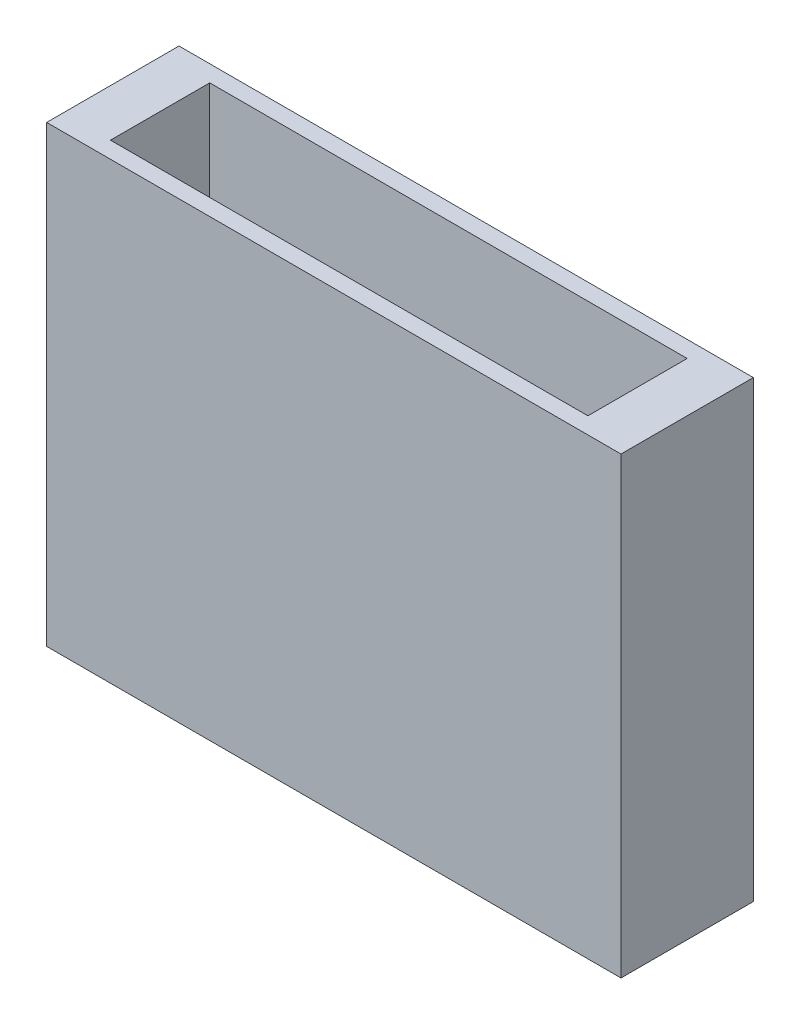
ISO-10303-21;
HEADER;
FILE_DESCRIPTION(('STEP AP214'),'2;1');
FILE_NAME('part.step','',(''),(''),'','','');
FILE_SCHEMA(('AUTOMOTIVE_DESIGN { 1 0 10303 214 1 1 1 1 }'));
ENDSEC;
DATA;
#1=APPLICATION_CONTEXT('core data for automotive mechanical design processes');
#2=APPLICATION_PROTOCOL_DEFINITION('international standard','automotive_design',2000,#1);
#3=PRODUCT_CONTEXT('',#1,'mechanical');
#4=PRODUCT('Part','Part','',(#3));
#5=PRODUCT_RELATED_PRODUCT_CATEGORY('part','',(#4));
#6=PRODUCT_DEFINITION_FORMATION('','',#4);
#7=PRODUCT_DEFINITION_CONTEXT('part definition',#1,'design');
#8=PRODUCT_DEFINITION('design','',#6,#7);
#9=PRODUCT_DEFINITION_SHAPE('','',#8);
#10=(LENGTH_UNIT() NAMED_UNIT(*) SI_UNIT(.MILLI.,.METRE.));
#11=(NAMED_UNIT(*) PLANE_ANGLE_UNIT() SI_UNIT($,.RADIAN.));
#12=(NAMED_UNIT(*) SI_UNIT($,.STERADIAN.) SOLID_ANGLE_UNIT());
#13=UNCERTAINTY_MEASURE_WITH_UNIT(LENGTH_MEASURE(1.E-05),#10,'distance_accuracy_value','');
#14=(GEOMETRIC_REPRESENTATION_CONTEXT(3) GLOBAL_UNCERTAINTY_ASSIGNED_CONTEXT((#13)) GLOBAL_UNIT_ASSIGNED_CONTEXT((#10,
#11,#12)) REPRESENTATION_CONTEXT('',''));
#15=CARTESIAN_POINT('',(0.,0.,0.));
#16=DIRECTION('',(0.,0.,1.));
#17=DIRECTION('',(1.,0.,0.));
#18=AXIS2_PLACEMENT_3D('',#15,#16,#17);
#19=CARTESIAN_POINT('',(0.,0.,5.6));
#20=DIRECTION('',(1.,0.,0.));
#21=DIRECTION('',(0.,0.,-1.));
#22=AXIS2_PLACEMENT_3D('',#19,#20,#21);
#23=PLANE('',#22);
#24=DIRECTION('',(0.,-1.,0.));
#25=VECTOR('',#24,1.);
#26=CARTESIAN_POINT('',(0.,0.,0.));
#27=LINE('',#26,#25);
#28=CARTESIAN_POINT('',(0.,19.2,0.));
#29=VERTEX_POINT('',#28);
#30=CARTESIAN_POINT('',(0.,0.,0.));
#31=VERTEX_POINT('',#30);
#32=EDGE_CURVE('E265',#29,#31,#27,.T.);
#33=ORIENTED_EDGE('',*,*,#32,.T.);
#34=DIRECTION('',(0.,0.,-1.));
#35=VECTOR('',#34,1.);
#36=CARTESIAN_POINT('',(0.,0.,5.6));
#37=LINE('',#36,#35);
#38=CARTESIAN_POINT('',(0.,0.,5.6));
#39=VERTEX_POINT('',#38);
#40=EDGE_CURVE('E312',#39,#31,#37,.T.);
#41=ORIENTED_EDGE('',*,*,#40,.F.);
#42=DIRECTION('',(0.,-1.,0.));
#43=VECTOR('',#42,1.);
#44=CARTESIAN_POINT('',(0.,0.,5.6));
#45=LINE('',#44,#43);
#46=CARTESIAN_POINT('',(0.,19.2,5.6));
#47=VERTEX_POINT('',#46);
#48=EDGE_CURVE('E275',#47,#39,#45,.T.);
#49=ORIENTED_EDGE('',*,*,#48,.F.);
#50=DIRECTION('',(0.,0.,-1.));
#51=VECTOR('',#50,1.);
#52=CARTESIAN_POINT('',(0.,19.2,5.6));
#53=LINE('',#52,#51);
#54=EDGE_CURVE('E289',#47,#29,#53,.T.);
#55=ORIENTED_EDGE('',*,*,#54,.T.);
#56=EDGE_LOOP('',(#33,#41,#49,#55));
#57=FACE_BOUND('',#56,.T.);
#58=ADVANCED_FACE('F39',(#57),#23,.F.);
#59=CARTESIAN_POINT('',(0.,0.,5.6));
#60=DIRECTION('',(0.,1.,0.));
#61=DIRECTION('',(0.,0.,1.));
#62=AXIS2_PLACEMENT_3D('',#59,#60,#61);
#63=PLANE('',#62);
#64=DIRECTION('',(1.,0.,0.));
#65=VECTOR('',#64,1.);
#66=CARTESIAN_POINT('',(0.,0.,0.));
#67=LINE('',#66,#65);
#68=CARTESIAN_POINT('',(24.3,0.,0.));
#69=VERTEX_POINT('',#68);
#70=EDGE_CURVE('E293',#31,#69,#67,.T.);
#71=ORIENTED_EDGE('',*,*,#70,.T.);
#72=DIRECTION('',(0.,0.,-1.));
#73=VECTOR('',#72,1.);
#74=CARTESIAN_POINT('',(24.3,0.,5.6));
#75=LINE('',#74,#73);
#76=CARTESIAN_POINT('',(24.3,0.,5.6));
#77=VERTEX_POINT('',#76);
#78=EDGE_CURVE('E308',#77,#69,#75,.T.);
#79=ORIENTED_EDGE('',*,*,#78,.F.);
#80=DIRECTION('',(1.,0.,0.));
#81=VECTOR('',#80,1.);
#82=CARTESIAN_POINT('',(0.,0.,5.6));
#83=LINE('',#82,#81);
#84=EDGE_CURVE('E279',#39,#77,#83,.T.);
#85=ORIENTED_EDGE('',*,*,#84,.F.);
#86=ORIENTED_EDGE('',*,*,#40,.T.);
#87=EDGE_LOOP('',(#71,#79,#85,#86));
#88=FACE_BOUND('',#87,.T.);
#89=ADVANCED_FACE('F440',(#88),#63,.F.);
#90=CARTESIAN_POINT('',(24.3,0.,5.6));
#91=DIRECTION('',(-1.,0.,0.));
#92=DIRECTION('',(0.,0.,1.));
#93=AXIS2_PLACEMENT_3D('',#90,#91,#92);
#94=PLANE('',#93);
#95=DIRECTION('',(0.,1.,0.));
#96=VECTOR('',#95,1.);
#97=CARTESIAN_POINT('',(24.3,0.,0.));
#98=LINE('',#97,#96);
#99=CARTESIAN_POINT('',(24.3,19.2,0.));
#100=VERTEX_POINT('',#99);
#101=EDGE_CURVE('E296',#69,#100,#98,.T.);
#102=ORIENTED_EDGE('',*,*,#101,.T.);
#103=DIRECTION('',(0.,0.,-1.));
#104=VECTOR('',#103,1.);
#105=CARTESIAN_POINT('',(24.3,19.2,5.6));
#106=LINE('',#105,#104);
#107=CARTESIAN_POINT('',(24.3,19.2,5.6));
#108=VERTEX_POINT('',#107);
#109=EDGE_CURVE('E304',#108,#100,#106,.T.);
#110=ORIENTED_EDGE('',*,*,#109,.F.);
#111=DIRECTION('',(0.,1.,0.));
#112=VECTOR('',#111,1.);
#113=CARTESIAN_POINT('',(24.3,0.,5.6));
#114=LINE('',#113,#112);
#115=EDGE_CURVE('E283',#77,#108,#114,.T.);
#116=ORIENTED_EDGE('',*,*,#115,.F.);
#117=ORIENTED_EDGE('',*,*,#78,.T.);
#118=EDGE_LOOP('',(#102,#110,#116,#117));
#119=FACE_BOUND('',#118,.T.);
#120=ADVANCED_FACE('F446',(#119),#94,.F.);
#121=CARTESIAN_POINT('',(0.,19.2,5.6));
#122=DIRECTION('',(0.,-1.,0.));
#123=DIRECTION('',(0.,0.,-1.));
#124=AXIS2_PLACEMENT_3D('',#121,#122,#123);
#125=PLANE('',#124);
#126=DIRECTION('',(1.,0.,0.));
#127=VECTOR('',#126,1.);
#128=CARTESIAN_POINT('',(2.,19.2,4.9));
#129=LINE('',#128,#127);
#130=CARTESIAN_POINT('',(2.,19.2,4.9));
#131=VERTEX_POINT('',#130);
#132=CARTESIAN_POINT('',(22.2,19.2,4.9));
#133=VERTEX_POINT('',#132);
#134=EDGE_CURVE('E251',#131,#133,#129,.T.);
#135=ORIENTED_EDGE('',*,*,#134,.F.);
#136=DIRECTION('',(0.,0.,1.));
#137=VECTOR('',#136,1.);
#138=CARTESIAN_POINT('',(2.,19.2,4.9));
#139=LINE('',#138,#137);
#140=CARTESIAN_POINT('',(2.,19.2,0.699999999999999));
#141=VERTEX_POINT('',#140);
#142=EDGE_CURVE('E219',#141,#131,#139,.T.);
#143=ORIENTED_EDGE('',*,*,#142,.F.);
#144=DIRECTION('',(-1.,0.,0.));
#145=VECTOR('',#144,1.);
#146=CARTESIAN_POINT('',(2.,19.2,0.699999999999999));
#147=LINE('',#146,#145);
#148=CARTESIAN_POINT('',(22.2,19.2,0.699999999999999));
#149=VERTEX_POINT('',#148);
#150=EDGE_CURVE('E236',#149,#141,#147,.T.);
#151=ORIENTED_EDGE('',*,*,#150,.F.);
#152=DIRECTION('',(0.,0.,-1.));
#153=VECTOR('',#152,1.);
#154=CARTESIAN_POINT('',(22.2,19.2,4.9));
#155=LINE('',#154,#153);
#156=EDGE_CURVE('E255',#133,#149,#155,.T.);
#157=ORIENTED_EDGE('',*,*,#156,.F.);
#158=EDGE_LOOP('',(#135,#143,#151,#157));
#159=FACE_BOUND('',#158,.T.);
#160=DIRECTION('',(-1.,0.,0.));
#161=VECTOR('',#160,1.);
#162=CARTESIAN_POINT('',(0.,19.2,0.));
#163=LINE('',#162,#161);
#164=EDGE_CURVE('E280',#100,#29,#163,.T.);
#165=ORIENTED_EDGE('',*,*,#164,.T.);
#166=ORIENTED_EDGE('',*,*,#54,.F.);
#167=DIRECTION('',(-1.,0.,0.));
#168=VECTOR('',#167,1.);
#169=CARTESIAN_POINT('',(0.,19.2,5.6));
#170=LINE('',#169,#168);
#171=EDGE_CURVE('E286',#108,#47,#170,.T.);
#172=ORIENTED_EDGE('',*,*,#171,.F.);
#173=ORIENTED_EDGE('',*,*,#109,.T.);
#174=EDGE_LOOP('',(#165,#166,#172,#173));
#175=FACE_BOUND('',#174,.T.);
#176=ADVANCED_FACE('F622',(#159,#175),#125,.F.);
#177=CARTESIAN_POINT('',(0.,0.,5.6));
#178=DIRECTION('',(0.,0.,-1.));
#179=DIRECTION('',(-1.,0.,0.));
#180=AXIS2_PLACEMENT_3D('',#177,#178,#179);
#181=PLANE('',#180);
#182=ORIENTED_EDGE('',*,*,#48,.T.);
#183=ORIENTED_EDGE('',*,*,#84,.T.);
#184=ORIENTED_EDGE('',*,*,#115,.T.);
#185=ORIENTED_EDGE('',*,*,#171,.T.);
#186=EDGE_LOOP('',(#182,#183,#184,#185));
#187=FACE_BOUND('',#186,.T.);
#188=ADVANCED_FACE('F568',(#187),#181,.F.);
#189=CARTESIAN_POINT('',(0.,0.,0.));
#190=DIRECTION('',(0.,0.,-1.));
#191=DIRECTION('',(-1.,0.,0.));
#192=AXIS2_PLACEMENT_3D('',#189,#190,#191);
#193=PLANE('',#192);
#194=DIRECTION('',(0.,-1.,0.));
#195=VECTOR('',#194,1.);
#196=CARTESIAN_POINT('',(21.0424776614557,16.8401074790745,0.));
#197=LINE('',#196,#195);
#198=CARTESIAN_POINT('',(21.0424776614557,16.8401074790745,0.));
#199=VERTEX_POINT('',#198);
#200=CARTESIAN_POINT('',(21.0424776614557,2.84010747907446,0.));
#201=VERTEX_POINT('',#200);
#202=EDGE_CURVE('E199',#199,#201,#197,.T.);
#203=ORIENTED_EDGE('',*,*,#202,.F.);
#204=DIRECTION('',(1.,0.,0.));
#205=VECTOR('',#204,1.);
#206=CARTESIAN_POINT('',(21.0424776614557,16.8401074790745,0.));
#207=LINE('',#206,#205);
#208=CARTESIAN_POINT('',(3.04247766145567,16.8401074790745,0.));
#209=VERTEX_POINT('',#208);
#210=EDGE_CURVE('E194',#209,#199,#207,.T.);
#211=ORIENTED_EDGE('',*,*,#210,.F.);
#212=DIRECTION('',(0.,1.,0.));
#213=VECTOR('',#212,1.);
#214=CARTESIAN_POINT('',(3.04247766145567,16.8401074790745,0.));
#215=LINE('',#214,#213);
#216=CARTESIAN_POINT('',(3.04247766145567,2.84010747907446,0.));
#217=VERTEX_POINT('',#216);
#218=EDGE_CURVE('E179',#217,#209,#215,.T.);
#219=ORIENTED_EDGE('',*,*,#218,.F.);
#220=DIRECTION('',(-1.,0.,0.));
#221=VECTOR('',#220,1.);
#222=CARTESIAN_POINT('',(21.0424776614557,2.84010747907446,0.));
#223=LINE('',#222,#221);
#224=EDGE_CURVE('E191',#201,#217,#223,.T.);
#225=ORIENTED_EDGE('',*,*,#224,.F.);
#226=EDGE_LOOP('',(#203,#211,#219,#225));
#227=FACE_BOUND('',#226,.T.);
#228=ORIENTED_EDGE('',*,*,#32,.F.);
#229=ORIENTED_EDGE('',*,*,#164,.F.);
#230=ORIENTED_EDGE('',*,*,#101,.F.);
#231=ORIENTED_EDGE('',*,*,#70,.F.);
#232=EDGE_LOOP('',(#228,#229,#230,#231));
#233=FACE_BOUND('',#232,.T.);
#234=ADVANCED_FACE('F189',(#227,#233),#193,.T.);
#235=CARTESIAN_POINT('',(2.,1.2,4.9));
#236=DIRECTION('',(-1.,0.,0.));
#237=DIRECTION('',(0.,0.,1.));
#238=AXIS2_PLACEMENT_3D('',#235,#236,#237);
#239=PLANE('',#238);
#240=ORIENTED_EDGE('',*,*,#142,.T.);
#241=DIRECTION('',(0.,1.,0.));
#242=VECTOR('',#241,1.);
#243=CARTESIAN_POINT('',(2.,1.2,4.9));
#244=LINE('',#243,#242);
#245=CARTESIAN_POINT('',(2.,1.2,4.9));
#246=VERTEX_POINT('',#245);
#247=EDGE_CURVE('E248',#246,#131,#244,.T.);
#248=ORIENTED_EDGE('',*,*,#247,.F.);
#249=DIRECTION('',(0.,0.,1.));
#250=VECTOR('',#249,1.);
#251=CARTESIAN_POINT('',(2.,1.2,4.9));
#252=LINE('',#251,#250);
#253=CARTESIAN_POINT('',(2.,1.2,0.699999999999999));
#254=VERTEX_POINT('',#253);
#255=EDGE_CURVE('E231',#254,#246,#252,.T.);
#256=ORIENTED_EDGE('',*,*,#255,.F.);
#257=DIRECTION('',(0.,1.,0.));
#258=VECTOR('',#257,1.);
#259=CARTESIAN_POINT('',(2.,1.2,0.699999999999999));
#260=LINE('',#259,#258);
#261=EDGE_CURVE('E262',#254,#141,#260,.T.);
#262=ORIENTED_EDGE('',*,*,#261,.T.);
#263=EDGE_LOOP('',(#240,#248,#256,#262));
#264=FACE_BOUND('',#263,.T.);
#265=ADVANCED_FACE('F567',(#264),#239,.F.);
#266=CARTESIAN_POINT('',(2.,1.2,0.699999999999999));
#267=DIRECTION('',(0.,0.,-1.));
#268=DIRECTION('',(-1.,0.,0.));
#269=AXIS2_PLACEMENT_3D('',#266,#267,#268);
#270=PLANE('',#269);
#271=DIRECTION('',(1.,0.,0.));
#272=VECTOR('',#271,1.);
#273=CARTESIAN_POINT('',(2.,13.,0.699999999999999));
#274=LINE('',#273,#272);
#275=CARTESIAN_POINT('',(9.65,13.,0.699999999999999));
#276=VERTEX_POINT('',#275);
#277=CARTESIAN_POINT('',(14.65,13.,0.699999999999999));
#278=VERTEX_POINT('',#277);
#279=EDGE_CURVE('E324',#276,#278,#274,.T.);
#280=ORIENTED_EDGE('',*,*,#279,.T.);
#281=DIRECTION('',(0.,-1.,0.));
#282=VECTOR('',#281,1.);
#283=CARTESIAN_POINT('',(14.65,1.2,0.699999999999999));
#284=LINE('',#283,#282);
#285=CARTESIAN_POINT('',(14.65,6.8,0.699999999999999));
#286=VERTEX_POINT('',#285);
#287=EDGE_CURVE('E328',#278,#286,#284,.T.);
#288=ORIENTED_EDGE('',*,*,#287,.T.);
#289=DIRECTION('',(-1.,0.,0.));
#290=VECTOR('',#289,1.);
#291=CARTESIAN_POINT('',(2.,6.8,0.699999999999999));
#292=LINE('',#291,#290);
#293=CARTESIAN_POINT('',(9.65,6.8,0.699999999999999));
#294=VERTEX_POINT('',#293);
#295=EDGE_CURVE('E316',#286,#294,#292,.T.);
#296=ORIENTED_EDGE('',*,*,#295,.T.);
#297=DIRECTION('',(0.,1.,0.));
#298=VECTOR('',#297,1.);
#299=CARTESIAN_POINT('',(9.65,1.2,0.699999999999999));
#300=LINE('',#299,#298);
#301=EDGE_CURVE('E320',#294,#276,#300,.T.);
#302=ORIENTED_EDGE('',*,*,#301,.T.);
#303=EDGE_LOOP('',(#280,#288,#296,#302));
#304=FACE_BOUND('',#303,.T.);
#305=ORIENTED_EDGE('',*,*,#150,.T.);
#306=ORIENTED_EDGE('',*,*,#261,.F.);
#307=DIRECTION('',(-1.,0.,0.));
#308=VECTOR('',#307,1.);
#309=CARTESIAN_POINT('',(2.,1.2,0.699999999999999));
#310=LINE('',#309,#308);
#311=CARTESIAN_POINT('',(22.2,1.2,0.699999999999999));
#312=VERTEX_POINT('',#311);
#313=EDGE_CURVE('E244',#312,#254,#310,.T.);
#314=ORIENTED_EDGE('',*,*,#313,.F.);
#315=DIRECTION('',(0.,1.,0.));
#316=VECTOR('',#315,1.);
#317=CARTESIAN_POINT('',(22.2,1.2,0.699999999999999));
#318=LINE('',#317,#316);
#319=EDGE_CURVE('E266',#312,#149,#318,.T.);
#320=ORIENTED_EDGE('',*,*,#319,.T.);
#321=EDGE_LOOP('',(#305,#306,#314,#320));
#322=FACE_BOUND('',#321,.T.);
#323=ADVANCED_FACE('F577',(#304,#322),#270,.F.);
#324=CARTESIAN_POINT('',(22.2,1.2,4.9));
#325=DIRECTION('',(1.,0.,0.));
#326=DIRECTION('',(0.,0.,-1.));
#327=AXIS2_PLACEMENT_3D('',#324,#325,#326);
#328=PLANE('',#327);
#329=ORIENTED_EDGE('',*,*,#156,.T.);
#330=ORIENTED_EDGE('',*,*,#319,.F.);
#331=DIRECTION('',(0.,0.,-1.));
#332=VECTOR('',#331,1.);
#333=CARTESIAN_POINT('',(22.2,1.2,4.9));
#334=LINE('',#333,#332);
#335=CARTESIAN_POINT('',(22.2,1.2,4.9));
#336=VERTEX_POINT('',#335);
#337=EDGE_CURVE('E240',#336,#312,#334,.T.);
#338=ORIENTED_EDGE('',*,*,#337,.F.);
#339=DIRECTION('',(0.,1.,0.));
#340=VECTOR('',#339,1.);
#341=CARTESIAN_POINT('',(22.2,1.2,4.9));
#342=LINE('',#341,#340);
#343=EDGE_CURVE('E269',#336,#133,#342,.T.);
#344=ORIENTED_EDGE('',*,*,#343,.T.);
#345=EDGE_LOOP('',(#329,#330,#338,#344));
#346=FACE_BOUND('',#345,.T.);
#347=ADVANCED_FACE('F582',(#346),#328,.F.);
#348=CARTESIAN_POINT('',(2.,1.2,4.9));
#349=DIRECTION('',(0.,0.,1.));
#350=DIRECTION('',(1.,0.,0.));
#351=AXIS2_PLACEMENT_3D('',#348,#349,#350);
#352=PLANE('',#351);
#353=ORIENTED_EDGE('',*,*,#134,.T.);
#354=ORIENTED_EDGE('',*,*,#343,.F.);
#355=DIRECTION('',(1.,0.,0.));
#356=VECTOR('',#355,1.);
#357=CARTESIAN_POINT('',(2.,1.2,4.9));
#358=LINE('',#357,#356);
#359=EDGE_CURVE('E235',#246,#336,#358,.T.);
#360=ORIENTED_EDGE('',*,*,#359,.F.);
#361=ORIENTED_EDGE('',*,*,#247,.T.);
#362=EDGE_LOOP('',(#353,#354,#360,#361));
#363=FACE_BOUND('',#362,.T.);
#364=ADVANCED_FACE('F593',(#363),#352,.F.);
#365=CARTESIAN_POINT('',(0.,1.2,0.));
#366=DIRECTION('',(0.,-1.,0.));
#367=DIRECTION('',(0.,0.,-1.));
#368=AXIS2_PLACEMENT_3D('',#365,#366,#367);
#369=PLANE('',#368);
#370=ORIENTED_EDGE('',*,*,#255,.T.);
#371=ORIENTED_EDGE('',*,*,#359,.T.);
#372=ORIENTED_EDGE('',*,*,#337,.T.);
#373=ORIENTED_EDGE('',*,*,#313,.T.);
#374=EDGE_LOOP('',(#370,#371,#372,#373));
#375=FACE_BOUND('',#374,.T.);
#376=ADVANCED_FACE('F555',(#375),#369,.F.);
#377=CARTESIAN_POINT('',(14.65,6.8,2.));
#378=DIRECTION('',(1.,0.,0.));
#379=DIRECTION('',(0.,0.,-1.));
#380=AXIS2_PLACEMENT_3D('',#377,#378,#379);
#381=PLANE('',#380);
#382=DIRECTION('',(0.,0.,-1.));
#383=VECTOR('',#382,1.);
#384=CARTESIAN_POINT('',(14.65,13.,2.));
#385=LINE('',#384,#383);
#386=CARTESIAN_POINT('',(14.65,13.,-1.));
#387=VERTEX_POINT('',#386);
#388=EDGE_CURVE('E215',#278,#387,#385,.T.);
#389=ORIENTED_EDGE('',*,*,#388,.T.);
#390=DIRECTION('',(0.,-1.,0.));
#391=VECTOR('',#390,1.);
#392=CARTESIAN_POINT('',(14.65,6.8,-1.));
#393=LINE('',#392,#391);
#394=CARTESIAN_POINT('',(14.65,6.8,-1.));
#395=VERTEX_POINT('',#394);
#396=EDGE_CURVE('E365',#387,#395,#393,.T.);
#397=ORIENTED_EDGE('',*,*,#396,.T.);
#398=DIRECTION('',(0.,0.,-1.));
#399=VECTOR('',#398,1.);
#400=CARTESIAN_POINT('',(14.65,6.8,2.));
#401=LINE('',#400,#399);
#402=EDGE_CURVE('E214',#286,#395,#401,.T.);
#403=ORIENTED_EDGE('',*,*,#402,.F.);
#404=ORIENTED_EDGE('',*,*,#287,.F.);
#405=EDGE_LOOP('',(#389,#397,#403,#404));
#406=FACE_BOUND('',#405,.T.);
#407=ADVANCED_FACE('F544',(#406),#381,.F.);
#408=CARTESIAN_POINT('',(14.65,13.,2.));
#409=DIRECTION('',(0.,1.,0.));
#410=DIRECTION('',(0.,0.,1.));
#411=AXIS2_PLACEMENT_3D('',#408,#409,#410);
#412=PLANE('',#411);
#413=DIRECTION('',(0.,0.,-1.));
#414=VECTOR('',#413,1.);
#415=CARTESIAN_POINT('',(9.65,13.,2.));
#416=LINE('',#415,#414);
#417=CARTESIAN_POINT('',(9.65,13.,-1.));
#418=VERTEX_POINT('',#417);
#419=EDGE_CURVE('E220',#276,#418,#416,.T.);
#420=ORIENTED_EDGE('',*,*,#419,.T.);
#421=DIRECTION('',(1.,0.,0.));
#422=VECTOR('',#421,1.);
#423=CARTESIAN_POINT('',(14.65,13.,-1.));
#424=LINE('',#423,#422);
#425=EDGE_CURVE('E362',#418,#387,#424,.T.);
#426=ORIENTED_EDGE('',*,*,#425,.T.);
#427=ORIENTED_EDGE('',*,*,#388,.F.);
#428=ORIENTED_EDGE('',*,*,#279,.F.);
#429=EDGE_LOOP('',(#420,#426,#427,#428));
#430=FACE_BOUND('',#429,.T.);
#431=ADVANCED_FACE('F533',(#430),#412,.F.);
#432=CARTESIAN_POINT('',(9.65,6.8,2.));
#433=DIRECTION('',(-1.,0.,0.));
#434=DIRECTION('',(0.,0.,1.));
#435=AXIS2_PLACEMENT_3D('',#432,#433,#434);
#436=PLANE('',#435);
#437=DIRECTION('',(0.,0.,-1.));
#438=VECTOR('',#437,1.);
#439=CARTESIAN_POINT('',(9.65,6.8,2.));
#440=LINE('',#439,#438);
#441=CARTESIAN_POINT('',(9.65,6.8,-1.));
#442=VERTEX_POINT('',#441);
#443=EDGE_CURVE('E224',#294,#442,#440,.T.);
#444=ORIENTED_EDGE('',*,*,#443,.T.);
#445=DIRECTION('',(0.,1.,0.));
#446=VECTOR('',#445,1.);
#447=CARTESIAN_POINT('',(9.65,13.,-1.));
#448=LINE('',#447,#446);
#449=EDGE_CURVE('E332',#442,#418,#448,.T.);
#450=ORIENTED_EDGE('',*,*,#449,.T.);
#451=ORIENTED_EDGE('',*,*,#419,.F.);
#452=ORIENTED_EDGE('',*,*,#301,.F.);
#453=EDGE_LOOP('',(#444,#450,#451,#452));
#454=FACE_BOUND('',#453,.T.);
#455=ADVANCED_FACE('F435',(#454),#436,.F.);
#456=CARTESIAN_POINT('',(14.65,6.8,2.));
#457=DIRECTION('',(0.,-1.,0.));
#458=DIRECTION('',(0.,0.,-1.));
#459=AXIS2_PLACEMENT_3D('',#456,#457,#458);
#460=PLANE('',#459);
#461=ORIENTED_EDGE('',*,*,#402,.T.);
#462=DIRECTION('',(-1.,0.,0.));
#463=VECTOR('',#462,1.);
#464=CARTESIAN_POINT('',(9.65,6.8,-1.));
#465=LINE('',#464,#463);
#466=EDGE_CURVE('E368',#395,#442,#465,.T.);
#467=ORIENTED_EDGE('',*,*,#466,.T.);
#468=ORIENTED_EDGE('',*,*,#443,.F.);
#469=ORIENTED_EDGE('',*,*,#295,.F.);
#470=EDGE_LOOP('',(#461,#467,#468,#469));
#471=FACE_BOUND('',#470,.T.);
#472=ADVANCED_FACE('F427',(#471),#460,.F.);
#473=CARTESIAN_POINT('',(0.,0.,-2.));
#474=DIRECTION('',(0.,0.,-1.));
#475=DIRECTION('',(-1.,0.,0.));
#476=AXIS2_PLACEMENT_3D('',#473,#474,#475);
#477=PLANE('',#476);
#478=DIRECTION('',(1.,0.,0.));
#479=VECTOR('',#478,1.);
#480=CARTESIAN_POINT('',(9.65,14.,-2.));
#481=LINE('',#480,#479);
#482=CARTESIAN_POINT('',(15.65,14.,-2.));
#483=VERTEX_POINT('',#482);
#484=CARTESIAN_POINT('',(8.65,14.,-2.));
#485=VERTEX_POINT('',#484);
#486=EDGE_CURVE('E355',#483,#485,#481,.F.);
#487=ORIENTED_EDGE('',*,*,#486,.T.);
#488=DIRECTION('',(0.,1.,0.));
#489=VECTOR('',#488,1.);
#490=CARTESIAN_POINT('',(8.65,6.8,-2.));
#491=LINE('',#490,#489);
#492=CARTESIAN_POINT('',(8.65,5.8,-2.));
#493=VERTEX_POINT('',#492);
#494=EDGE_CURVE('E358',#485,#493,#491,.F.);
#495=ORIENTED_EDGE('',*,*,#494,.T.);
#496=DIRECTION('',(-1.,0.,0.));
#497=VECTOR('',#496,1.);
#498=CARTESIAN_POINT('',(14.65,5.8,-2.));
#499=LINE('',#498,#497);
#500=CARTESIAN_POINT('',(15.65,5.8,-2.));
#501=VERTEX_POINT('',#500);
#502=EDGE_CURVE('E349',#493,#501,#499,.F.);
#503=ORIENTED_EDGE('',*,*,#502,.T.);
#504=DIRECTION('',(0.,-1.,0.));
#505=VECTOR('',#504,1.);
#506=CARTESIAN_POINT('',(15.65,13.,-2.));
#507=LINE('',#506,#505);
#508=EDGE_CURVE('E352',#501,#483,#507,.F.);
#509=ORIENTED_EDGE('',*,*,#508,.T.);
#510=EDGE_LOOP('',(#487,#495,#503,#509));
#511=FACE_BOUND('',#510,.T.);
#512=DIRECTION('',(0.,1.,0.));
#513=VECTOR('',#512,1.);
#514=CARTESIAN_POINT('',(4.04247766145567,16.8401074790745,-2.));
#515=LINE('',#514,#513);
#516=CARTESIAN_POINT('',(4.04247766145567,3.84010747907446,-2.));
#517=VERTEX_POINT('',#516);
#518=CARTESIAN_POINT('',(4.04247766145567,15.8401074790745,-2.));
#519=VERTEX_POINT('',#518);
#520=EDGE_CURVE('E342',#517,#519,#515,.T.);
#521=ORIENTED_EDGE('',*,*,#520,.T.);
#522=DIRECTION('',(1.,0.,0.));
#523=VECTOR('',#522,1.);
#524=CARTESIAN_POINT('',(21.0424776614557,15.8401074790745,-2.));
#525=LINE('',#524,#523);
#526=CARTESIAN_POINT('',(20.0424776614557,15.8401074790745,-2.));
#527=VERTEX_POINT('',#526);
#528=EDGE_CURVE('E345',#519,#527,#525,.T.);
#529=ORIENTED_EDGE('',*,*,#528,.T.);
#530=DIRECTION('',(0.,-1.,0.));
#531=VECTOR('',#530,1.);
#532=CARTESIAN_POINT('',(20.0424776614557,2.84010747907446,-2.));
#533=LINE('',#532,#531);
#534=CARTESIAN_POINT('',(20.0424776614557,3.84010747907446,-2.));
#535=VERTEX_POINT('',#534);
#536=EDGE_CURVE('E336',#527,#535,#533,.T.);
#537=ORIENTED_EDGE('',*,*,#536,.T.);
#538=DIRECTION('',(-1.,0.,0.));
#539=VECTOR('',#538,1.);
#540=CARTESIAN_POINT('',(3.04247766145567,3.84010747907446,-2.));
#541=LINE('',#540,#539);
#542=EDGE_CURVE('E339',#535,#517,#541,.T.);
#543=ORIENTED_EDGE('',*,*,#542,.T.);
#544=EDGE_LOOP('',(#521,#529,#537,#543));
#545=FACE_BOUND('',#544,.T.);
#546=ADVANCED_FACE('F425',(#511,#545),#477,.T.);
#547=CARTESIAN_POINT('',(21.0424776614557,16.8401074790745,-2.));
#548=DIRECTION('',(-1.,0.,0.));
#549=DIRECTION('',(0.,0.,1.));
#550=AXIS2_PLACEMENT_3D('',#547,#548,#549);
#551=PLANE('',#550);
#552=DIRECTION('',(0.,0.,1.));
#553=VECTOR('',#552,1.);
#554=CARTESIAN_POINT('',(21.0424776614557,2.84010747907446,-2.));
#555=LINE('',#554,#553);
#556=CARTESIAN_POINT('',(21.0424776614557,2.84010747907446,-1.));
#557=VERTEX_POINT('',#556);
#558=EDGE_CURVE('E182',#557,#201,#555,.T.);
#559=ORIENTED_EDGE('',*,*,#558,.F.);
#560=DIRECTION('',(0.,-1.,0.));
#561=VECTOR('',#560,1.);
#562=CARTESIAN_POINT('',(21.0424776614557,16.8401074790745,-1.));
#563=LINE('',#562,#561);
#564=CARTESIAN_POINT('',(21.0424776614557,16.8401074790745,-1.));
#565=VERTEX_POINT('',#564);
#566=EDGE_CURVE('E11',#557,#565,#563,.F.);
#567=ORIENTED_EDGE('',*,*,#566,.T.);
#568=DIRECTION('',(0.,0.,1.));
#569=VECTOR('',#568,1.);
#570=CARTESIAN_POINT('',(21.0424776614557,16.8401074790745,-2.));
#571=LINE('',#570,#569);
#572=EDGE_CURVE('E207',#565,#199,#571,.T.);
#573=ORIENTED_EDGE('',*,*,#572,.T.);
#574=ORIENTED_EDGE('',*,*,#202,.T.);
#575=EDGE_LOOP('',(#559,#567,#573,#574));
#576=FACE_BOUND('',#575,.T.);
#577=ADVANCED_FACE('F417',(#576),#551,.F.);
#578=CARTESIAN_POINT('',(21.0424776614557,2.84010747907446,-2.));
#579=DIRECTION('',(0.,1.,0.));
#580=DIRECTION('',(0.,0.,1.));
#581=AXIS2_PLACEMENT_3D('',#578,#579,#580);
#582=PLANE('',#581);
#583=DIRECTION('',(0.,0.,1.));
#584=VECTOR('',#583,1.);
#585=CARTESIAN_POINT('',(3.04247766145567,2.84010747907446,-2.));
#586=LINE('',#585,#584);
#587=CARTESIAN_POINT('',(3.04247766145567,2.84010747907446,-1.));
#588=VERTEX_POINT('',#587);
#589=EDGE_CURVE('E176',#588,#217,#586,.T.);
#590=ORIENTED_EDGE('',*,*,#589,.F.);
#591=DIRECTION('',(-1.,0.,0.));
#592=VECTOR('',#591,1.);
#593=CARTESIAN_POINT('',(21.0424776614557,2.84010747907446,-1.));
#594=LINE('',#593,#592);
#595=EDGE_CURVE('E49',#588,#557,#594,.F.);
#596=ORIENTED_EDGE('',*,*,#595,.T.);
#597=ORIENTED_EDGE('',*,*,#558,.T.);
#598=ORIENTED_EDGE('',*,*,#224,.T.);
#599=EDGE_LOOP('',(#590,#596,#597,#598));
#600=FACE_BOUND('',#599,.T.);
#601=ADVANCED_FACE('F197',(#600),#582,.F.);
#602=CARTESIAN_POINT('',(3.04247766145567,16.8401074790745,-2.));
#603=DIRECTION('',(1.,0.,0.));
#604=DIRECTION('',(0.,1.,0.));
#605=AXIS2_PLACEMENT_3D('',#602,#603,#604);
#606=PLANE('',#605);
#607=DIRECTION('',(0.,0.,1.));
#608=VECTOR('',#607,1.);
#609=CARTESIAN_POINT('',(3.04247766145567,16.8401074790745,-2.));
#610=LINE('',#609,#608);
#611=CARTESIAN_POINT('',(3.04247766145567,16.8401074790745,-1.));
#612=VERTEX_POINT('',#611);
#613=EDGE_CURVE('E183',#612,#209,#610,.T.);
#614=ORIENTED_EDGE('',*,*,#613,.F.);
#615=DIRECTION('',(0.,1.,0.));
#616=VECTOR('',#615,1.);
#617=CARTESIAN_POINT('',(3.04247766145567,2.84010747907446,-1.));
#618=LINE('',#617,#616);
#619=EDGE_CURVE('E64',#612,#588,#618,.F.);
#620=ORIENTED_EDGE('',*,*,#619,.T.);
#621=ORIENTED_EDGE('',*,*,#589,.T.);
#622=ORIENTED_EDGE('',*,*,#218,.T.);
#623=EDGE_LOOP('',(#614,#620,#621,#622));
#624=FACE_BOUND('',#623,.T.);
#625=ADVANCED_FACE('F178',(#624),#606,.F.);
#626=CARTESIAN_POINT('',(21.0424776614557,16.8401074790745,-2.));
#627=DIRECTION('',(0.,-1.,0.));
#628=DIRECTION('',(0.,0.,-1.));
#629=AXIS2_PLACEMENT_3D('',#626,#627,#628);
#630=PLANE('',#629);
#631=ORIENTED_EDGE('',*,*,#572,.F.);
#632=DIRECTION('',(1.,0.,0.));
#633=VECTOR('',#632,1.);
#634=CARTESIAN_POINT('',(3.04247766145567,16.8401074790745,-1.));
#635=LINE('',#634,#633);
#636=EDGE_CURVE('E371',#565,#612,#635,.F.);
#637=ORIENTED_EDGE('',*,*,#636,.T.);
#638=ORIENTED_EDGE('',*,*,#613,.T.);
#639=ORIENTED_EDGE('',*,*,#210,.T.);
#640=EDGE_LOOP('',(#631,#637,#638,#639));
#641=FACE_BOUND('',#640,.T.);
#642=ADVANCED_FACE('F420',(#641),#630,.F.);
#643=CARTESIAN_POINT('',(15.65,6.8,-1.));
#644=DIRECTION('',(0.,1.,0.));
#645=DIRECTION('',(0.,0.,1.));
#646=AXIS2_PLACEMENT_3D('',#643,#644,#645);
#647=CYLINDRICAL_SURFACE('',#646,1.);
#648=CARTESIAN_POINT('',(15.65,14.,-1.));
#649=DIRECTION('',(-0.707106781186547,0.707106781186547,0.));
#650=DIRECTION('',(-0.707106781186547,-0.707106781186547,0.));
#651=AXIS2_PLACEMENT_3D('',#648,#649,#650);
#652=ELLIPSE('',#651,1.41421356237309,1.);
#653=EDGE_CURVE('E385',#483,#387,#652,.T.);
#654=ORIENTED_EDGE('',*,*,#653,.F.);
#655=ORIENTED_EDGE('',*,*,#508,.F.);
#656=CARTESIAN_POINT('',(15.65,5.8,-1.));
#657=DIRECTION('',(0.707106781186547,0.707106781186547,0.));
#658=DIRECTION('',(-0.707106781186547,0.707106781186547,0.));
#659=AXIS2_PLACEMENT_3D('',#656,#657,#658);
#660=ELLIPSE('',#659,1.41421356237309,1.);
#661=EDGE_CURVE('E202',#395,#501,#660,.F.);
#662=ORIENTED_EDGE('',*,*,#661,.F.);
#663=ORIENTED_EDGE('',*,*,#396,.F.);
#664=EDGE_LOOP('',(#654,#655,#662,#663));
#665=FACE_BOUND('',#664,.T.);
#666=ADVANCED_FACE('F462',(#665),#647,.T.);
#667=CARTESIAN_POINT('',(14.65,5.8,-1.));
#668=DIRECTION('',(1.,0.,0.));
#669=DIRECTION('',(0.,0.,-1.));
#670=AXIS2_PLACEMENT_3D('',#667,#668,#669);
#671=CYLINDRICAL_SURFACE('',#670,1.);
#672=ORIENTED_EDGE('',*,*,#661,.T.);
#673=ORIENTED_EDGE('',*,*,#502,.F.);
#674=CARTESIAN_POINT('',(8.65,5.8,-1.));
#675=DIRECTION('',(0.707106781186547,-0.707106781186547,0.));
#676=DIRECTION('',(-0.707106781186547,-0.707106781186547,0.));
#677=AXIS2_PLACEMENT_3D('',#674,#675,#676);
#678=ELLIPSE('',#677,1.41421356237309,1.);
#679=EDGE_CURVE('E382',#442,#493,#678,.F.);
#680=ORIENTED_EDGE('',*,*,#679,.F.);
#681=ORIENTED_EDGE('',*,*,#466,.F.);
#682=EDGE_LOOP('',(#672,#673,#680,#681));
#683=FACE_BOUND('',#682,.T.);
#684=ADVANCED_FACE('F458',(#683),#671,.T.);
#685=CARTESIAN_POINT('',(14.65,14.,-1.));
#686=DIRECTION('',(-1.,0.,0.));
#687=DIRECTION('',(0.,0.,1.));
#688=AXIS2_PLACEMENT_3D('',#685,#686,#687);
#689=CYLINDRICAL_SURFACE('',#688,1.);
#690=ORIENTED_EDGE('',*,*,#653,.T.);
#691=ORIENTED_EDGE('',*,*,#425,.F.);
#692=CARTESIAN_POINT('',(8.65,14.,-1.));
#693=DIRECTION('',(-0.707106781186547,-0.707106781186547,0.));
#694=DIRECTION('',(0.707106781186547,-0.707106781186547,0.));
#695=AXIS2_PLACEMENT_3D('',#692,#693,#694);
#696=ELLIPSE('',#695,1.41421356237309,1.);
#697=EDGE_CURVE('E379',#485,#418,#696,.T.);
#698=ORIENTED_EDGE('',*,*,#697,.F.);
#699=ORIENTED_EDGE('',*,*,#486,.F.);
#700=EDGE_LOOP('',(#690,#691,#698,#699));
#701=FACE_BOUND('',#700,.T.);
#702=ADVANCED_FACE('F454',(#701),#689,.T.);
#703=CARTESIAN_POINT('',(8.65,6.8,-1.));
#704=DIRECTION('',(0.,-1.,0.));
#705=DIRECTION('',(0.,0.,-1.));
#706=AXIS2_PLACEMENT_3D('',#703,#704,#705);
#707=CYLINDRICAL_SURFACE('',#706,1.);
#708=ORIENTED_EDGE('',*,*,#679,.T.);
#709=ORIENTED_EDGE('',*,*,#494,.F.);
#710=ORIENTED_EDGE('',*,*,#697,.T.);
#711=ORIENTED_EDGE('',*,*,#449,.F.);
#712=EDGE_LOOP('',(#708,#709,#710,#711));
#713=FACE_BOUND('',#712,.T.);
#714=ADVANCED_FACE('F451',(#713),#707,.T.);
#715=CARTESIAN_POINT('',(0.,3.84010747907446,-1.));
#716=DIRECTION('',(1.,0.,0.));
#717=DIRECTION('',(0.,0.,-1.));
#718=AXIS2_PLACEMENT_3D('',#715,#716,#717);
#719=CYLINDRICAL_SURFACE('',#718,1.);
#720=CARTESIAN_POINT('',(20.0424776614557,3.84010747907446,-1.));
#721=DIRECTION('',(0.707106781186547,0.707106781186547,0.));
#722=DIRECTION('',(-0.707106781186547,0.707106781186547,0.));
#723=AXIS2_PLACEMENT_3D('',#720,#721,#722);
#724=ELLIPSE('',#723,1.41421356237309,1.);
#725=EDGE_CURVE('E397',#557,#535,#724,.T.);
#726=ORIENTED_EDGE('',*,*,#725,.F.);
#727=ORIENTED_EDGE('',*,*,#595,.F.);
#728=CARTESIAN_POINT('',(4.04247766145567,3.84010747907446,-1.));
#729=DIRECTION('',(0.707106781186547,-0.707106781186548,0.));
#730=DIRECTION('',(0.707106781186548,0.707106781186547,0.));
#731=AXIS2_PLACEMENT_3D('',#728,#729,#730);
#732=ELLIPSE('',#731,1.4142135623731,1.);
#733=EDGE_CURVE('E43',#517,#588,#732,.F.);
#734=ORIENTED_EDGE('',*,*,#733,.F.);
#735=ORIENTED_EDGE('',*,*,#542,.F.);
#736=EDGE_LOOP('',(#726,#727,#734,#735));
#737=FACE_BOUND('',#736,.T.);
#738=ADVANCED_FACE('F41',(#737),#719,.T.);
#739=CARTESIAN_POINT('',(4.04247766145567,0.,-1.));
#740=DIRECTION('',(0.,-1.,0.));
#741=DIRECTION('',(1.,0.,0.));
#742=AXIS2_PLACEMENT_3D('',#739,#740,#741);
#743=CYLINDRICAL_SURFACE('',#742,1.);
#744=ORIENTED_EDGE('',*,*,#733,.T.);
#745=ORIENTED_EDGE('',*,*,#619,.F.);
#746=CARTESIAN_POINT('',(4.04247766145567,15.8401074790745,-1.));
#747=DIRECTION('',(-0.707106781186548,-0.707106781186547,0.));
#748=DIRECTION('',(0.707106781186547,-0.707106781186548,0.));
#749=AXIS2_PLACEMENT_3D('',#746,#747,#748);
#750=ELLIPSE('',#749,1.41421356237309,1.);
#751=EDGE_CURVE('E395',#519,#612,#750,.F.);
#752=ORIENTED_EDGE('',*,*,#751,.F.);
#753=ORIENTED_EDGE('',*,*,#520,.F.);
#754=EDGE_LOOP('',(#744,#745,#752,#753));
#755=FACE_BOUND('',#754,.T.);
#756=ADVANCED_FACE('F409',(#755),#743,.T.);
#757=CARTESIAN_POINT('',(20.0424776614557,0.,-1.));
#758=DIRECTION('',(0.,1.,0.));
#759=DIRECTION('',(0.,0.,1.));
#760=AXIS2_PLACEMENT_3D('',#757,#758,#759);
#761=CYLINDRICAL_SURFACE('',#760,1.);
#762=ORIENTED_EDGE('',*,*,#725,.T.);
#763=ORIENTED_EDGE('',*,*,#536,.F.);
#764=CARTESIAN_POINT('',(20.0424776614557,15.8401074790745,-1.));
#765=DIRECTION('',(-0.707106781186547,0.707106781186547,0.));
#766=DIRECTION('',(0.707106781186547,0.707106781186547,0.));
#767=AXIS2_PLACEMENT_3D('',#764,#765,#766);
#768=ELLIPSE('',#767,1.41421356237309,1.);
#769=EDGE_CURVE('E392',#565,#527,#768,.T.);
#770=ORIENTED_EDGE('',*,*,#769,.F.);
#771=ORIENTED_EDGE('',*,*,#566,.F.);
#772=EDGE_LOOP('',(#762,#763,#770,#771));
#773=FACE_BOUND('',#772,.T.);
#774=ADVANCED_FACE('F414',(#773),#761,.T.);
#775=CARTESIAN_POINT('',(0.,15.8401074790745,-1.));
#776=DIRECTION('',(-1.,0.,0.));
#777=DIRECTION('',(0.,0.,1.));
#778=AXIS2_PLACEMENT_3D('',#775,#776,#777);
#779=CYLINDRICAL_SURFACE('',#778,1.);
#780=ORIENTED_EDGE('',*,*,#751,.T.);
#781=ORIENTED_EDGE('',*,*,#636,.F.);
#782=ORIENTED_EDGE('',*,*,#769,.T.);
#783=ORIENTED_EDGE('',*,*,#528,.F.);
#784=EDGE_LOOP('',(#780,#781,#782,#783));
#785=FACE_BOUND('',#784,.T.);
#786=ADVANCED_FACE('F422',(#785),#779,.T.);
#787=CLOSED_SHELL('',(#58,#89,#120,#176,#188,#234,#265,#323,#347,#364,#376,#407,#431,#455,#472,
#546,#577,#601,#625,#642,#666,#684,#702,#714,#738,#756,#774,#786));
#788=MANIFOLD_SOLID_BREP('B2',#787);
#789=ADVANCED_BREP_SHAPE_REPRESENTATION('',(#18,#788),#14);
#790=SHAPE_DEFINITION_REPRESENTATION(#9,#789);
ENDSEC;
END-ISO-10303-21;
